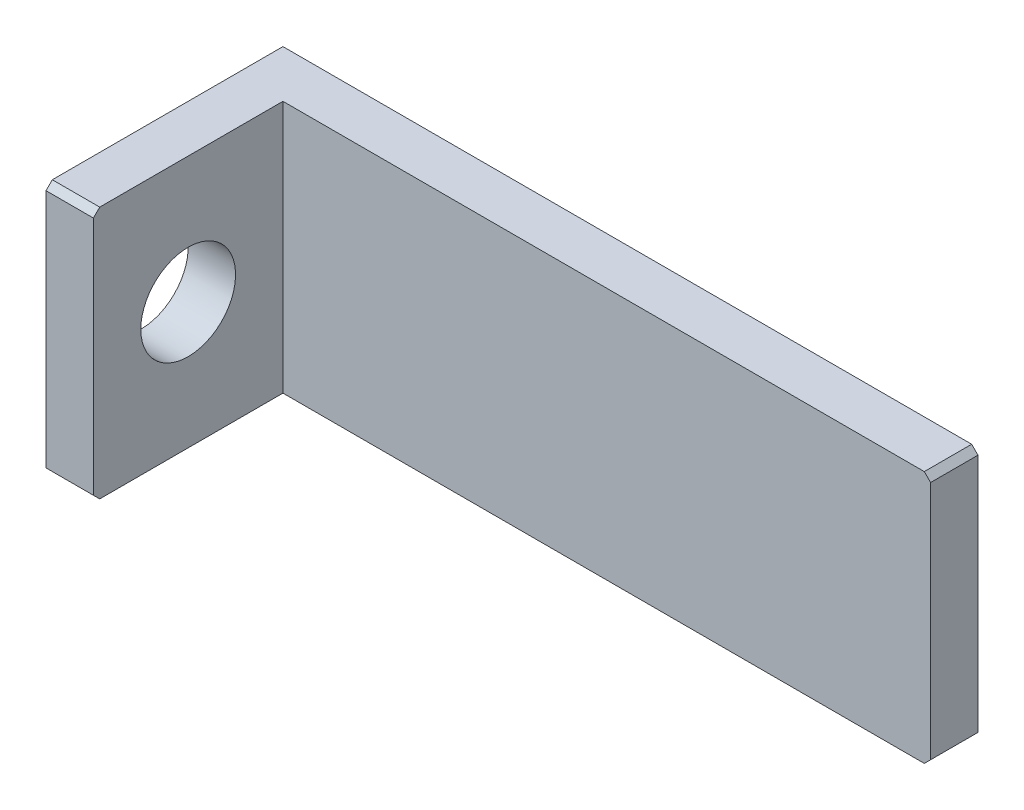
ISO-10303-21;
HEADER;
FILE_DESCRIPTION(('STEP AP214'),'2;1');
FILE_NAME('part.step','',(''),(''),'','','');
FILE_SCHEMA(('AUTOMOTIVE_DESIGN { 1 0 10303 214 1 1 1 1 }'));
ENDSEC;
DATA;
#1=APPLICATION_CONTEXT('core data for automotive mechanical design processes');
#2=APPLICATION_PROTOCOL_DEFINITION('international standard','automotive_design',2000,#1);
#3=PRODUCT_CONTEXT('',#1,'mechanical');
#4=PRODUCT('Part','Part','',(#3));
#5=PRODUCT_RELATED_PRODUCT_CATEGORY('part','',(#4));
#6=PRODUCT_DEFINITION_FORMATION('','',#4);
#7=PRODUCT_DEFINITION_CONTEXT('part definition',#1,'design');
#8=PRODUCT_DEFINITION('design','',#6,#7);
#9=PRODUCT_DEFINITION_SHAPE('','',#8);
#10=(LENGTH_UNIT() NAMED_UNIT(*) SI_UNIT(.MILLI.,.METRE.));
#11=(NAMED_UNIT(*) PLANE_ANGLE_UNIT() SI_UNIT($,.RADIAN.));
#12=(NAMED_UNIT(*) SI_UNIT($,.STERADIAN.) SOLID_ANGLE_UNIT());
#13=UNCERTAINTY_MEASURE_WITH_UNIT(LENGTH_MEASURE(1.E-05),#10,'distance_accuracy_value','');
#14=(GEOMETRIC_REPRESENTATION_CONTEXT(3) GLOBAL_UNCERTAINTY_ASSIGNED_CONTEXT((#13)) GLOBAL_UNIT_ASSIGNED_CONTEXT((#10,
#11,#12)) REPRESENTATION_CONTEXT('',''));
#15=CARTESIAN_POINT('',(0.,0.,0.));
#16=DIRECTION('',(0.,0.,1.));
#17=DIRECTION('',(1.,0.,0.));
#18=AXIS2_PLACEMENT_3D('',#15,#16,#17);
#19=CARTESIAN_POINT('',(-159.757123161513,671.232012286222,-366.457743681072));
#20=DIRECTION('',(0.,0.707106781186447,0.707106781186648));
#21=DIRECTION('',(0.,-0.707106781186648,0.707106781186447));
#22=AXIS2_PLACEMENT_3D('',#19,#20,#21);
#23=PLANE('',#22);
#24=DIRECTION('',(0.,-0.707106781186648,0.707106781186447));
#25=VECTOR('',#24,1.);
#26=CARTESIAN_POINT('',(-160.507123161513,671.232012286222,-366.457743681072));
#27=LINE('',#26,#25);
#28=CARTESIAN_POINT('',(-160.507123161513,671.332012286222,-366.557743681072));
#29=VERTEX_POINT('',#28);
#30=CARTESIAN_POINT('',(-160.507123161513,671.132012286222,-366.357743681072));
#31=VERTEX_POINT('',#30);
#32=EDGE_CURVE('E111',#29,#31,#27,.T.);
#33=ORIENTED_EDGE('',*,*,#32,.T.);
#34=DIRECTION('',(-1.,0.,0.));
#35=VECTOR('',#34,1.);
#36=CARTESIAN_POINT('',(-159.757123161513,671.132012286222,-366.357743681072));
#37=LINE('',#36,#35);
#38=CARTESIAN_POINT('',(-159.007123161513,671.132012286222,-366.357743681072));
#39=VERTEX_POINT('',#38);
#40=EDGE_CURVE('E108',#31,#39,#37,.F.);
#41=ORIENTED_EDGE('',*,*,#40,.T.);
#42=DIRECTION('',(0.,-0.707106781186646,0.707106781186449));
#43=VECTOR('',#42,1.);
#44=CARTESIAN_POINT('',(-159.007123161513,671.332012286222,-366.557743681072));
#45=LINE('',#44,#43);
#46=CARTESIAN_POINT('',(-159.007123161513,671.332012286222,-366.557743681072));
#47=VERTEX_POINT('',#46);
#48=EDGE_CURVE('E99',#47,#39,#45,.T.);
#49=ORIENTED_EDGE('',*,*,#48,.F.);
#50=DIRECTION('',(1.,0.,0.));
#51=VECTOR('',#50,1.);
#52=CARTESIAN_POINT('',(-159.757123161513,671.332012286222,-366.557743681072));
#53=LINE('',#52,#51);
#54=EDGE_CURVE('E176',#47,#29,#53,.F.);
#55=ORIENTED_EDGE('',*,*,#54,.T.);
#56=EDGE_LOOP('',(#33,#41,#49,#55));
#57=FACE_BOUND('',#56,.T.);
#58=ADVANCED_FACE('F20',(#57),#23,.T.);
#59=CARTESIAN_POINT('',(-159.757123161513,667.332012286222,-366.357743681072));
#60=DIRECTION('',(0.,0.,-1.));
#61=DIRECTION('',(-1.,0.,0.));
#62=AXIS2_PLACEMENT_3D('',#59,#60,#61);
#63=PLANE('',#62);
#64=DIRECTION('',(0.,1.,0.));
#65=VECTOR('',#64,1.);
#66=CARTESIAN_POINT('',(-159.007123161513,667.332012286222,-366.357743681072));
#67=LINE('',#66,#65);
#68=CARTESIAN_POINT('',(-159.007123161513,663.532012286222,-366.357743681072));
#69=VERTEX_POINT('',#68);
#70=EDGE_CURVE('E96',#39,#69,#67,.F.);
#71=ORIENTED_EDGE('',*,*,#70,.F.);
#72=ORIENTED_EDGE('',*,*,#40,.F.);
#73=DIRECTION('',(0.,1.,0.));
#74=VECTOR('',#73,1.);
#75=CARTESIAN_POINT('',(-160.507123161513,667.332012286222,-366.357743681072));
#76=LINE('',#75,#74);
#77=CARTESIAN_POINT('',(-160.507123161513,663.532012286222,-366.357743681072));
#78=VERTEX_POINT('',#77);
#79=EDGE_CURVE('E169',#31,#78,#76,.F.);
#80=ORIENTED_EDGE('',*,*,#79,.T.);
#81=DIRECTION('',(1.,0.,0.));
#82=VECTOR('',#81,1.);
#83=CARTESIAN_POINT('',(-159.757123161513,663.532012286222,-366.357743681072));
#84=LINE('',#83,#82);
#85=EDGE_CURVE('E119',#69,#78,#84,.F.);
#86=ORIENTED_EDGE('',*,*,#85,.F.);
#87=EDGE_LOOP('',(#71,#72,#80,#86));
#88=FACE_BOUND('',#87,.T.);
#89=ADVANCED_FACE('F118',(#88),#63,.F.);
#90=CARTESIAN_POINT('',(-158.007123161513,667.332012286222,-369.357743681072));
#91=DIRECTION('',(-1.,0.,0.));
#92=DIRECTION('',(0.,0.,1.));
#93=AXIS2_PLACEMENT_3D('',#90,#91,#92);
#94=CYLINDRICAL_SURFACE('',#93,1.5);
#95=CARTESIAN_POINT('',(-159.007123161513,667.332012286222,-369.357743681072));
#96=DIRECTION('',(-1.,0.,0.));
#97=DIRECTION('',(0.,0.,1.));
#98=AXIS2_PLACEMENT_3D('',#95,#96,#97);
#99=CIRCLE('',#98,1.5);
#100=CARTESIAN_POINT('',(-159.007123161513,667.332012286222,-367.857743681072));
#101=VERTEX_POINT('',#100);
#102=EDGE_CURVE('E23',#101,#101,#99,.T.);
#103=ORIENTED_EDGE('',*,*,#102,.F.);
#104=EDGE_LOOP('',(#103));
#105=FACE_BOUND('',#104,.T.);
#106=CARTESIAN_POINT('',(-160.507123161513,667.332012286222,-369.357743681072));
#107=DIRECTION('',(-1.,0.,0.));
#108=DIRECTION('',(0.,0.,1.));
#109=AXIS2_PLACEMENT_3D('',#106,#107,#108);
#110=CIRCLE('',#109,1.5);
#111=CARTESIAN_POINT('',(-160.507123161513,667.332012286222,-367.857743681072));
#112=VERTEX_POINT('',#111);
#113=EDGE_CURVE('E156',#112,#112,#110,.T.);
#114=ORIENTED_EDGE('',*,*,#113,.T.);
#115=EDGE_LOOP('',(#114));
#116=FACE_BOUND('',#115,.T.);
#117=ADVANCED_FACE('F327',(#105,#116),#94,.F.);
#118=CARTESIAN_POINT('',(-159.007123161513,667.332012286222,-367.357743681072));
#119=DIRECTION('',(1.,0.,0.));
#120=DIRECTION('',(0.,0.,-1.));
#121=AXIS2_PLACEMENT_3D('',#118,#119,#120);
#122=PLANE('',#121);
#123=ORIENTED_EDGE('',*,*,#102,.T.);
#124=EDGE_LOOP('',(#123));
#125=FACE_BOUND('',#124,.T.);
#126=ORIENTED_EDGE('',*,*,#48,.T.);
#127=ORIENTED_EDGE('',*,*,#70,.T.);
#128=DIRECTION('',(0.,-0.707106781186648,-0.707106781186447));
#129=VECTOR('',#128,1.);
#130=CARTESIAN_POINT('',(-159.007123161513,663.432012286222,-366.457743681072));
#131=LINE('',#130,#129);
#132=CARTESIAN_POINT('',(-159.007123161513,663.332012286222,-366.557743681072));
#133=VERTEX_POINT('',#132);
#134=EDGE_CURVE('E125',#133,#69,#131,.F.);
#135=ORIENTED_EDGE('',*,*,#134,.F.);
#136=DIRECTION('',(0.,0.,1.));
#137=VECTOR('',#136,1.);
#138=CARTESIAN_POINT('',(-159.007123161513,663.332012286222,-367.357743681072));
#139=LINE('',#138,#137);
#140=CARTESIAN_POINT('',(-159.007123161513,663.332012286222,-372.357743681072));
#141=VERTEX_POINT('',#140);
#142=EDGE_CURVE('E151',#133,#141,#139,.F.);
#143=ORIENTED_EDGE('',*,*,#142,.T.);
#144=DIRECTION('',(0.,1.,0.));
#145=VECTOR('',#144,1.);
#146=CARTESIAN_POINT('',(-159.007123161513,667.332012286222,-372.357743681072));
#147=LINE('',#146,#145);
#148=CARTESIAN_POINT('',(-159.007123161513,671.332012286222,-372.357743681072));
#149=VERTEX_POINT('',#148);
#150=EDGE_CURVE('E140',#141,#149,#147,.T.);
#151=ORIENTED_EDGE('',*,*,#150,.T.);
#152=DIRECTION('',(0.,0.,-1.));
#153=VECTOR('',#152,1.);
#154=CARTESIAN_POINT('',(-159.007123161513,671.332012286222,-367.357743681072));
#155=LINE('',#154,#153);
#156=EDGE_CURVE('E103',#149,#47,#155,.F.);
#157=ORIENTED_EDGE('',*,*,#156,.T.);
#158=EDGE_LOOP('',(#126,#127,#135,#143,#151,#157));
#159=FACE_BOUND('',#158,.T.);
#160=ADVANCED_FACE('F101',(#125,#159),#122,.T.);
#161=CARTESIAN_POINT('',(-159.757123161513,663.432012286222,-366.457743681072));
#162=DIRECTION('',(0.,-0.707106781186447,0.707106781186648));
#163=DIRECTION('',(0.,-0.707106781186648,-0.707106781186447));
#164=AXIS2_PLACEMENT_3D('',#161,#162,#163);
#165=PLANE('',#164);
#166=ORIENTED_EDGE('',*,*,#134,.T.);
#167=ORIENTED_EDGE('',*,*,#85,.T.);
#168=DIRECTION('',(0.,-0.707106781186253,-0.707106781186842));
#169=VECTOR('',#168,1.);
#170=CARTESIAN_POINT('',(-160.507123161513,663.532012286222,-366.357743681072));
#171=LINE('',#170,#169);
#172=CARTESIAN_POINT('',(-160.507123161513,663.332012286222,-366.557743681072));
#173=VERTEX_POINT('',#172);
#174=EDGE_CURVE('E164',#78,#173,#171,.T.);
#175=ORIENTED_EDGE('',*,*,#174,.T.);
#176=DIRECTION('',(1.,0.,0.));
#177=VECTOR('',#176,1.);
#178=CARTESIAN_POINT('',(-159.757123161513,663.332012286222,-366.557743681072));
#179=LINE('',#178,#177);
#180=EDGE_CURVE('E149',#173,#133,#179,.T.);
#181=ORIENTED_EDGE('',*,*,#180,.T.);
#182=EDGE_LOOP('',(#166,#167,#175,#181));
#183=FACE_BOUND('',#182,.T.);
#184=ADVANCED_FACE('F147',(#183),#165,.T.);
#185=CARTESIAN_POINT('',(-138.607123161513,671.232012286222,-370.232743681072));
#186=DIRECTION('',(0.707106781186648,0.707106781186447,0.));
#187=DIRECTION('',(-0.707106781186447,0.707106781186648,0.));
#188=AXIS2_PLACEMENT_3D('',#185,#186,#187);
#189=PLANE('',#188);
#190=DIRECTION('',(-0.707106781186447,0.707106781186648,0.));
#191=VECTOR('',#190,1.);
#192=CARTESIAN_POINT('',(-138.607123161513,671.232012286222,-373.857743681072));
#193=LINE('',#192,#191);
#194=CARTESIAN_POINT('',(-138.507123161513,671.132012286222,-373.857743681072));
#195=VERTEX_POINT('',#194);
#196=CARTESIAN_POINT('',(-138.707123161513,671.332012286222,-373.857743681072));
#197=VERTEX_POINT('',#196);
#198=EDGE_CURVE('E39',#195,#197,#193,.T.);
#199=ORIENTED_EDGE('',*,*,#198,.T.);
#200=DIRECTION('',(0.,0.,-1.));
#201=VECTOR('',#200,1.);
#202=CARTESIAN_POINT('',(-138.707123161513,671.332012286222,-367.357743681072));
#203=LINE('',#202,#201);
#204=CARTESIAN_POINT('',(-138.707123161513,671.332012286222,-372.357743681072));
#205=VERTEX_POINT('',#204);
#206=EDGE_CURVE('E185',#197,#205,#203,.F.);
#207=ORIENTED_EDGE('',*,*,#206,.T.);
#208=DIRECTION('',(0.7071067811864,-0.707106781186695,0.));
#209=VECTOR('',#208,1.);
#210=CARTESIAN_POINT('',(-138.707123161513,671.332012286222,-372.357743681072));
#211=LINE('',#210,#209);
#212=CARTESIAN_POINT('',(-138.507123161513,671.132012286222,-372.357743681072));
#213=VERTEX_POINT('',#212);
#214=EDGE_CURVE('E194',#205,#213,#211,.T.);
#215=ORIENTED_EDGE('',*,*,#214,.T.);
#216=DIRECTION('',(0.,0.,-1.));
#217=VECTOR('',#216,1.);
#218=CARTESIAN_POINT('',(-138.507123161513,671.132012286222,-373.107743681072));
#219=LINE('',#218,#217);
#220=EDGE_CURVE('E203',#195,#213,#219,.F.);
#221=ORIENTED_EDGE('',*,*,#220,.F.);
#222=EDGE_LOOP('',(#199,#207,#215,#221));
#223=FACE_BOUND('',#222,.T.);
#224=ADVANCED_FACE('F202',(#223),#189,.T.);
#225=CARTESIAN_POINT('',(-149.507123161513,667.332012286222,-372.357743681072));
#226=DIRECTION('',(0.,0.,-1.));
#227=DIRECTION('',(-1.,0.,0.));
#228=AXIS2_PLACEMENT_3D('',#225,#226,#227);
#229=PLANE('',#228);
#230=DIRECTION('',(1.,0.,0.));
#231=VECTOR('',#230,1.);
#232=CARTESIAN_POINT('',(-159.757123161513,671.332012286222,-372.357743681072));
#233=LINE('',#232,#231);
#234=EDGE_CURVE('E181',#205,#149,#233,.F.);
#235=ORIENTED_EDGE('',*,*,#234,.T.);
#236=ORIENTED_EDGE('',*,*,#150,.F.);
#237=DIRECTION('',(1.,0.,0.));
#238=VECTOR('',#237,1.);
#239=CARTESIAN_POINT('',(-159.757123161513,663.332012286222,-372.357743681072));
#240=LINE('',#239,#238);
#241=CARTESIAN_POINT('',(-138.707123161513,663.332012286222,-372.357743681072));
#242=VERTEX_POINT('',#241);
#243=EDGE_CURVE('E155',#141,#242,#240,.T.);
#244=ORIENTED_EDGE('',*,*,#243,.T.);
#245=DIRECTION('',(0.707106781186447,0.707106781186648,0.));
#246=VECTOR('',#245,1.);
#247=CARTESIAN_POINT('',(-138.607123161513,663.432012286222,-372.357743681072));
#248=LINE('',#247,#246);
#249=CARTESIAN_POINT('',(-138.507123161513,663.532012286222,-372.357743681072));
#250=VERTEX_POINT('',#249);
#251=EDGE_CURVE('E189',#250,#242,#248,.F.);
#252=ORIENTED_EDGE('',*,*,#251,.F.);
#253=DIRECTION('',(0.,1.,0.));
#254=VECTOR('',#253,1.);
#255=CARTESIAN_POINT('',(-138.507123161513,667.332012286222,-372.357743681072));
#256=LINE('',#255,#254);
#257=EDGE_CURVE('E208',#213,#250,#256,.F.);
#258=ORIENTED_EDGE('',*,*,#257,.F.);
#259=ORIENTED_EDGE('',*,*,#214,.F.);
#260=EDGE_LOOP('',(#235,#236,#244,#252,#258,#259));
#261=FACE_BOUND('',#260,.T.);
#262=ADVANCED_FACE('F209',(#261),#229,.F.);
#263=CARTESIAN_POINT('',(-138.607123161513,663.432012286222,-370.232743681072));
#264=DIRECTION('',(0.707106781186648,-0.707106781186447,0.));
#265=DIRECTION('',(0.707106781186447,0.707106781186648,0.));
#266=AXIS2_PLACEMENT_3D('',#263,#264,#265);
#267=PLANE('',#266);
#268=ORIENTED_EDGE('',*,*,#251,.T.);
#269=DIRECTION('',(0.,0.,1.));
#270=VECTOR('',#269,1.);
#271=CARTESIAN_POINT('',(-138.707123161513,663.332012286222,-367.357743681072));
#272=LINE('',#271,#270);
#273=CARTESIAN_POINT('',(-138.707123161513,663.332012286222,-373.857743681072));
#274=VERTEX_POINT('',#273);
#275=EDGE_CURVE('E161',#242,#274,#272,.F.);
#276=ORIENTED_EDGE('',*,*,#275,.T.);
#277=DIRECTION('',(0.707106781186447,0.707106781186648,0.));
#278=VECTOR('',#277,1.);
#279=CARTESIAN_POINT('',(-138.607123161513,663.432012286222,-373.857743681072));
#280=LINE('',#279,#278);
#281=CARTESIAN_POINT('',(-138.507123161513,663.532012286222,-373.857743681072));
#282=VERTEX_POINT('',#281);
#283=EDGE_CURVE('E192',#274,#282,#280,.T.);
#284=ORIENTED_EDGE('',*,*,#283,.T.);
#285=DIRECTION('',(0.,0.,-1.));
#286=VECTOR('',#285,1.);
#287=CARTESIAN_POINT('',(-138.507123161513,663.532012286222,-373.107743681072));
#288=LINE('',#287,#286);
#289=EDGE_CURVE('E214',#250,#282,#288,.T.);
#290=ORIENTED_EDGE('',*,*,#289,.F.);
#291=EDGE_LOOP('',(#268,#276,#284,#290));
#292=FACE_BOUND('',#291,.T.);
#293=ADVANCED_FACE('F235',(#292),#267,.T.);
#294=CARTESIAN_POINT('',(-159.757123161513,671.332012286222,-367.357743681072));
#295=DIRECTION('',(0.,-1.,0.));
#296=DIRECTION('',(0.,0.,-1.));
#297=AXIS2_PLACEMENT_3D('',#294,#295,#296);
#298=PLANE('',#297);
#299=ORIENTED_EDGE('',*,*,#156,.F.);
#300=ORIENTED_EDGE('',*,*,#234,.F.);
#301=ORIENTED_EDGE('',*,*,#206,.F.);
#302=DIRECTION('',(1.,0.,0.));
#303=VECTOR('',#302,1.);
#304=CARTESIAN_POINT('',(-149.507123161513,671.332012286222,-373.857743681072));
#305=LINE('',#304,#303);
#306=CARTESIAN_POINT('',(-160.507123161513,671.332012286222,-373.857743681072));
#307=VERTEX_POINT('',#306);
#308=EDGE_CURVE('E218',#197,#307,#305,.F.);
#309=ORIENTED_EDGE('',*,*,#308,.T.);
#310=DIRECTION('',(0.,0.,-1.));
#311=VECTOR('',#310,1.);
#312=CARTESIAN_POINT('',(-160.507123161513,671.332012286222,-367.357743681072));
#313=LINE('',#312,#311);
#314=EDGE_CURVE('E172',#307,#29,#313,.F.);
#315=ORIENTED_EDGE('',*,*,#314,.T.);
#316=ORIENTED_EDGE('',*,*,#54,.F.);
#317=EDGE_LOOP('',(#299,#300,#301,#309,#315,#316));
#318=FACE_BOUND('',#317,.T.);
#319=ADVANCED_FACE('F249',(#318),#298,.F.);
#320=CARTESIAN_POINT('',(-160.507123161513,667.332012286222,-367.357743681072));
#321=DIRECTION('',(1.,0.,0.));
#322=DIRECTION('',(0.,0.,-1.));
#323=AXIS2_PLACEMENT_3D('',#320,#321,#322);
#324=PLANE('',#323);
#325=ORIENTED_EDGE('',*,*,#113,.F.);
#326=EDGE_LOOP('',(#325));
#327=FACE_BOUND('',#326,.T.);
#328=ORIENTED_EDGE('',*,*,#79,.F.);
#329=ORIENTED_EDGE('',*,*,#32,.F.);
#330=ORIENTED_EDGE('',*,*,#314,.F.);
#331=DIRECTION('',(0.,1.,0.));
#332=VECTOR('',#331,1.);
#333=CARTESIAN_POINT('',(-160.507123161513,667.332012286222,-373.857743681072));
#334=LINE('',#333,#332);
#335=CARTESIAN_POINT('',(-160.507123161513,663.332012286222,-373.857743681072));
#336=VERTEX_POINT('',#335);
#337=EDGE_CURVE('E241',#307,#336,#334,.F.);
#338=ORIENTED_EDGE('',*,*,#337,.T.);
#339=DIRECTION('',(0.,0.,1.));
#340=VECTOR('',#339,1.);
#341=CARTESIAN_POINT('',(-160.507123161513,663.332012286222,-367.357743681072));
#342=LINE('',#341,#340);
#343=EDGE_CURVE('E226',#336,#173,#342,.T.);
#344=ORIENTED_EDGE('',*,*,#343,.T.);
#345=ORIENTED_EDGE('',*,*,#174,.F.);
#346=EDGE_LOOP('',(#328,#329,#330,#338,#344,#345));
#347=FACE_BOUND('',#346,.T.);
#348=ADVANCED_FACE('F252',(#327,#347),#324,.F.);
#349=CARTESIAN_POINT('',(-159.757123161513,663.332012286222,-367.357743681072));
#350=DIRECTION('',(0.,1.,0.));
#351=DIRECTION('',(0.,0.,1.));
#352=AXIS2_PLACEMENT_3D('',#349,#350,#351);
#353=PLANE('',#352);
#354=ORIENTED_EDGE('',*,*,#343,.F.);
#355=DIRECTION('',(1.,0.,0.));
#356=VECTOR('',#355,1.);
#357=CARTESIAN_POINT('',(-149.507123161513,663.332012286222,-373.857743681072));
#358=LINE('',#357,#356);
#359=EDGE_CURVE('E31',#336,#274,#358,.T.);
#360=ORIENTED_EDGE('',*,*,#359,.T.);
#361=ORIENTED_EDGE('',*,*,#275,.F.);
#362=ORIENTED_EDGE('',*,*,#243,.F.);
#363=ORIENTED_EDGE('',*,*,#142,.F.);
#364=ORIENTED_EDGE('',*,*,#180,.F.);
#365=EDGE_LOOP('',(#354,#360,#361,#362,#363,#364));
#366=FACE_BOUND('',#365,.T.);
#367=ADVANCED_FACE('F237',(#366),#353,.F.);
#368=CARTESIAN_POINT('',(-138.507123161513,667.332012286222,-373.107743681072));
#369=DIRECTION('',(1.,0.,0.));
#370=DIRECTION('',(0.,0.,-1.));
#371=AXIS2_PLACEMENT_3D('',#368,#369,#370);
#372=PLANE('',#371);
#373=ORIENTED_EDGE('',*,*,#289,.T.);
#374=DIRECTION('',(0.,1.,0.));
#375=VECTOR('',#374,1.);
#376=CARTESIAN_POINT('',(-138.507123161513,667.332012286222,-373.857743681072));
#377=LINE('',#376,#375);
#378=EDGE_CURVE('E12',#282,#195,#377,.T.);
#379=ORIENTED_EDGE('',*,*,#378,.T.);
#380=ORIENTED_EDGE('',*,*,#220,.T.);
#381=ORIENTED_EDGE('',*,*,#257,.T.);
#382=EDGE_LOOP('',(#373,#379,#380,#381));
#383=FACE_BOUND('',#382,.T.);
#384=ADVANCED_FACE('F264',(#383),#372,.T.);
#385=CARTESIAN_POINT('',(-149.507123161513,667.332012286222,-373.857743681072));
#386=DIRECTION('',(0.,0.,1.));
#387=DIRECTION('',(1.,0.,0.));
#388=AXIS2_PLACEMENT_3D('',#385,#386,#387);
#389=PLANE('',#388);
#390=ORIENTED_EDGE('',*,*,#378,.F.);
#391=ORIENTED_EDGE('',*,*,#283,.F.);
#392=ORIENTED_EDGE('',*,*,#359,.F.);
#393=ORIENTED_EDGE('',*,*,#337,.F.);
#394=ORIENTED_EDGE('',*,*,#308,.F.);
#395=ORIENTED_EDGE('',*,*,#198,.F.);
#396=EDGE_LOOP('',(#390,#391,#392,#393,#394,#395));
#397=FACE_BOUND('',#396,.T.);
#398=ADVANCED_FACE('F250',(#397),#389,.F.);
#399=CLOSED_SHELL('',(#58,#89,#117,#160,#184,#224,#262,#293,#319,#348,#367,#384,#398));
#400=MANIFOLD_SOLID_BREP('B1',#399);
#401=ADVANCED_BREP_SHAPE_REPRESENTATION('',(#18,#400),#14);
#402=SHAPE_DEFINITION_REPRESENTATION(#9,#401);
ENDSEC;
END-ISO-10303-21;
